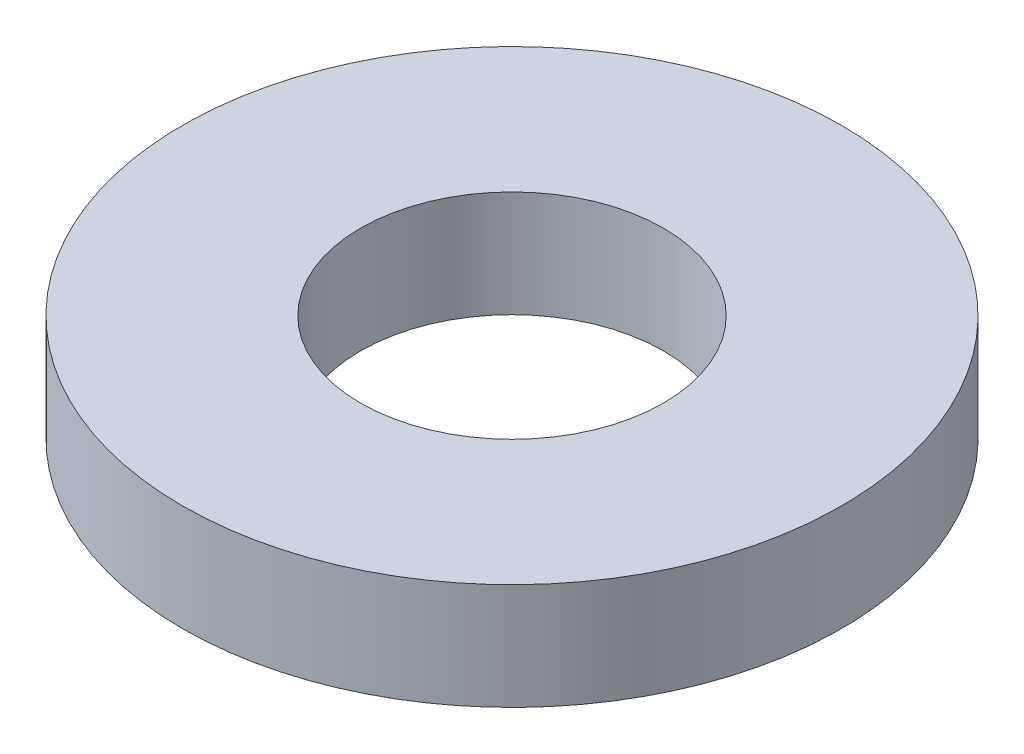
ISO-10303-21;
HEADER;
FILE_DESCRIPTION(('STEP AP214'),'2;1');
FILE_NAME('part.step','',(''),(''),'','','');
FILE_SCHEMA(('AUTOMOTIVE_DESIGN { 1 0 10303 214 1 1 1 1 }'));
ENDSEC;
DATA;
#1=APPLICATION_CONTEXT('core data for automotive mechanical design processes');
#2=APPLICATION_PROTOCOL_DEFINITION('international standard','automotive_design',2000,#1);
#3=PRODUCT_CONTEXT('',#1,'mechanical');
#4=PRODUCT('Part','Part','',(#3));
#5=PRODUCT_RELATED_PRODUCT_CATEGORY('part','',(#4));
#6=PRODUCT_DEFINITION_FORMATION('','',#4);
#7=PRODUCT_DEFINITION_CONTEXT('part definition',#1,'design');
#8=PRODUCT_DEFINITION('design','',#6,#7);
#9=PRODUCT_DEFINITION_SHAPE('','',#8);
#10=(LENGTH_UNIT() NAMED_UNIT(*) SI_UNIT(.MILLI.,.METRE.));
#11=(NAMED_UNIT(*) PLANE_ANGLE_UNIT() SI_UNIT($,.RADIAN.));
#12=(NAMED_UNIT(*) SI_UNIT($,.STERADIAN.) SOLID_ANGLE_UNIT());
#13=UNCERTAINTY_MEASURE_WITH_UNIT(LENGTH_MEASURE(1.E-05),#10,'distance_accuracy_value','');
#14=(GEOMETRIC_REPRESENTATION_CONTEXT(3) GLOBAL_UNCERTAINTY_ASSIGNED_CONTEXT((#13)) GLOBAL_UNIT_ASSIGNED_CONTEXT((#10,
#11,#12)) REPRESENTATION_CONTEXT('',''));
#15=CARTESIAN_POINT('',(0.,0.,0.));
#16=DIRECTION('',(0.,0.,1.));
#17=DIRECTION('',(1.,0.,0.));
#18=AXIS2_PLACEMENT_3D('',#15,#16,#17);
#19=CARTESIAN_POINT('',(0.,1.,0.));
#20=DIRECTION('',(0.,1.,0.));
#21=DIRECTION('',(0.,0.,1.));
#22=AXIS2_PLACEMENT_3D('',#19,#20,#21);
#23=PLANE('',#22);
#24=CARTESIAN_POINT('',(0.,1.,0.));
#25=DIRECTION('',(0.,1.,0.));
#26=DIRECTION('',(0.,0.,1.));
#27=AXIS2_PLACEMENT_3D('',#24,#25,#26);
#28=CIRCLE('',#27,3.1);
#29=CARTESIAN_POINT('',(0.,1.,3.1));
#30=VERTEX_POINT('',#29);
#31=EDGE_CURVE('E10',#30,#30,#28,.T.);
#32=ORIENTED_EDGE('',*,*,#31,.T.);
#33=EDGE_LOOP('',(#32));
#34=FACE_BOUND('',#33,.T.);
#35=CARTESIAN_POINT('',(0.,1.,0.));
#36=DIRECTION('',(0.,1.,0.));
#37=DIRECTION('',(0.,0.,1.));
#38=AXIS2_PLACEMENT_3D('',#35,#36,#37);
#39=CIRCLE('',#38,1.425);
#40=CARTESIAN_POINT('',(0.,1.,1.425));
#41=VERTEX_POINT('',#40);
#42=EDGE_CURVE('E50',#41,#41,#39,.T.);
#43=ORIENTED_EDGE('',*,*,#42,.F.);
#44=EDGE_LOOP('',(#43));
#45=FACE_BOUND('',#44,.T.);
#46=ADVANCED_FACE('F37',(#34,#45),#23,.T.);
#47=CARTESIAN_POINT('',(0.,0.,0.));
#48=DIRECTION('',(0.,1.,0.));
#49=DIRECTION('',(0.,0.,1.));
#50=AXIS2_PLACEMENT_3D('',#47,#48,#49);
#51=PLANE('',#50);
#52=CARTESIAN_POINT('',(0.,0.,0.));
#53=DIRECTION('',(0.,1.,0.));
#54=DIRECTION('',(0.,0.,1.));
#55=AXIS2_PLACEMENT_3D('',#52,#53,#54);
#56=CIRCLE('',#55,3.1);
#57=CARTESIAN_POINT('',(0.,0.,3.1));
#58=VERTEX_POINT('',#57);
#59=EDGE_CURVE('E41',#58,#58,#56,.T.);
#60=ORIENTED_EDGE('',*,*,#59,.F.);
#61=EDGE_LOOP('',(#60));
#62=FACE_BOUND('',#61,.T.);
#63=CARTESIAN_POINT('',(0.,0.,0.));
#64=DIRECTION('',(0.,1.,0.));
#65=DIRECTION('',(0.,0.,1.));
#66=AXIS2_PLACEMENT_3D('',#63,#64,#65);
#67=CIRCLE('',#66,1.425);
#68=CARTESIAN_POINT('',(0.,0.,1.425));
#69=VERTEX_POINT('',#68);
#70=EDGE_CURVE('E52',#69,#69,#67,.T.);
#71=ORIENTED_EDGE('',*,*,#70,.T.);
#72=EDGE_LOOP('',(#71));
#73=FACE_BOUND('',#72,.T.);
#74=ADVANCED_FACE('F64',(#62,#73),#51,.F.);
#75=CARTESIAN_POINT('',(0.,1.,0.));
#76=DIRECTION('',(0.,-1.,0.));
#77=DIRECTION('',(0.,0.,-1.));
#78=AXIS2_PLACEMENT_3D('',#75,#76,#77);
#79=CYLINDRICAL_SURFACE('',#78,3.1);
#80=ORIENTED_EDGE('',*,*,#31,.F.);
#81=EDGE_LOOP('',(#80));
#82=FACE_BOUND('',#81,.T.);
#83=ORIENTED_EDGE('',*,*,#59,.T.);
#84=EDGE_LOOP('',(#83));
#85=FACE_BOUND('',#84,.T.);
#86=ADVANCED_FACE('F39',(#82,#85),#79,.T.);
#87=CARTESIAN_POINT('',(0.,1.,0.));
#88=DIRECTION('',(0.,-1.,0.));
#89=DIRECTION('',(0.,0.,-1.));
#90=AXIS2_PLACEMENT_3D('',#87,#88,#89);
#91=CYLINDRICAL_SURFACE('',#90,1.425);
#92=ORIENTED_EDGE('',*,*,#42,.T.);
#93=EDGE_LOOP('',(#92));
#94=FACE_BOUND('',#93,.T.);
#95=ORIENTED_EDGE('',*,*,#70,.F.);
#96=EDGE_LOOP('',(#95));
#97=FACE_BOUND('',#96,.T.);
#98=ADVANCED_FACE('F60',(#94,#97),#91,.F.);
#99=CLOSED_SHELL('',(#46,#74,#86,#98));
#100=MANIFOLD_SOLID_BREP('B2',#99);
#101=ADVANCED_BREP_SHAPE_REPRESENTATION('',(#18,#100),#14);
#102=SHAPE_DEFINITION_REPRESENTATION(#9,#101);
ENDSEC;
END-ISO-10303-21;
